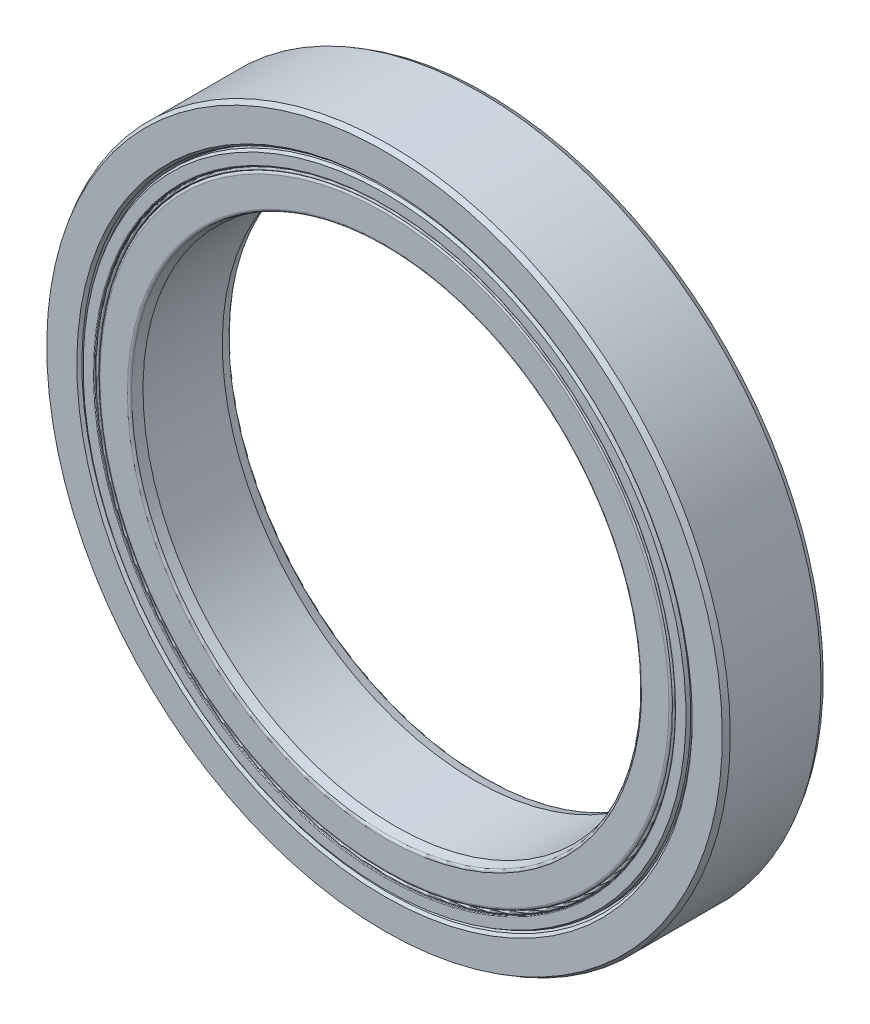
ISO-10303-21;
HEADER;
FILE_DESCRIPTION(('STEP AP214'),'2;1');
FILE_NAME('part.step','',(''),(''),'','','');
FILE_SCHEMA(('AUTOMOTIVE_DESIGN { 1 0 10303 214 1 1 1 1 }'));
ENDSEC;
DATA;
#1=APPLICATION_CONTEXT('core data for automotive mechanical design processes');
#2=APPLICATION_PROTOCOL_DEFINITION('international standard','automotive_design',2000,#1);
#3=PRODUCT_CONTEXT('',#1,'mechanical');
#4=PRODUCT('Part','Part','',(#3));
#5=PRODUCT_RELATED_PRODUCT_CATEGORY('part','',(#4));
#6=PRODUCT_DEFINITION_FORMATION('','',#4);
#7=PRODUCT_DEFINITION_CONTEXT('part definition',#1,'design');
#8=PRODUCT_DEFINITION('design','',#6,#7);
#9=PRODUCT_DEFINITION_SHAPE('','',#8);
#10=(LENGTH_UNIT() NAMED_UNIT(*) SI_UNIT(.MILLI.,.METRE.));
#11=(NAMED_UNIT(*) PLANE_ANGLE_UNIT() SI_UNIT($,.RADIAN.));
#12=(NAMED_UNIT(*) SI_UNIT($,.STERADIAN.) SOLID_ANGLE_UNIT());
#13=UNCERTAINTY_MEASURE_WITH_UNIT(LENGTH_MEASURE(1.E-05),#10,'distance_accuracy_value','');
#14=(GEOMETRIC_REPRESENTATION_CONTEXT(3) GLOBAL_UNCERTAINTY_ASSIGNED_CONTEXT((#13)) GLOBAL_UNIT_ASSIGNED_CONTEXT((#10,
#11,#12)) REPRESENTATION_CONTEXT('',''));
#15=CARTESIAN_POINT('',(0.,0.,0.));
#16=DIRECTION('',(0.,0.,1.));
#17=DIRECTION('',(1.,0.,0.));
#18=AXIS2_PLACEMENT_3D('',#15,#16,#17);
#19=CARTESIAN_POINT('',(0.,11.37,1.3125));
#20=DIRECTION('',(0.,0.,1.));
#21=DIRECTION('',(0.,-1.,0.));
#22=AXIS2_PLACEMENT_3D('',#19,#20,#21);
#23=PLANE('',#22);
#24=CARTESIAN_POINT('',(0.,0.,1.3125));
#25=DIRECTION('',(0.,0.,1.));
#26=DIRECTION('',(0.,-1.,0.));
#27=AXIS2_PLACEMENT_3D('',#24,#25,#26);
#28=CIRCLE('',#27,11.51);
#29=CARTESIAN_POINT('',(0.,-11.51,1.31249999999999));
#30=VERTEX_POINT('',#29);
#31=EDGE_CURVE('E11',#30,#30,#28,.T.);
#32=ORIENTED_EDGE('',*,*,#31,.F.);
#33=EDGE_LOOP('',(#32));
#34=FACE_BOUND('',#33,.T.);
#35=CARTESIAN_POINT('',(0.,0.,1.3125));
#36=DIRECTION('',(0.,0.,1.));
#37=DIRECTION('',(0.,-1.,0.));
#38=AXIS2_PLACEMENT_3D('',#35,#36,#37);
#39=CIRCLE('',#38,11.37);
#40=CARTESIAN_POINT('',(0.,-11.37,1.31249999999999));
#41=VERTEX_POINT('',#40);
#42=EDGE_CURVE('E70',#41,#41,#39,.T.);
#43=ORIENTED_EDGE('',*,*,#42,.T.);
#44=EDGE_LOOP('',(#43));
#45=FACE_BOUND('',#44,.T.);
#46=ADVANCED_FACE('F45',(#34,#45),#23,.F.);
#47=CARTESIAN_POINT('',(0.,0.,2.));
#48=DIRECTION('',(0.,0.,1.));
#49=DIRECTION('',(0.,-1.,0.));
#50=AXIS2_PLACEMENT_3D('',#47,#48,#49);
#51=CYLINDRICAL_SURFACE('',#50,11.51);
#52=CARTESIAN_POINT('',(0.,0.,1.89056210322341));
#53=DIRECTION('',(0.,0.,1.));
#54=DIRECTION('',(0.,-1.,0.));
#55=AXIS2_PLACEMENT_3D('',#52,#53,#54);
#56=CIRCLE('',#55,11.51);
#57=CARTESIAN_POINT('',(0.,-11.51,1.89056210322341));
#58=VERTEX_POINT('',#57);
#59=EDGE_CURVE('E51',#58,#58,#56,.T.);
#60=ORIENTED_EDGE('',*,*,#59,.F.);
#61=EDGE_LOOP('',(#60));
#62=FACE_BOUND('',#61,.T.);
#63=ORIENTED_EDGE('',*,*,#31,.T.);
#64=EDGE_LOOP('',(#63));
#65=FACE_BOUND('',#64,.T.);
#66=ADVANCED_FACE('F101',(#62,#65),#51,.T.);
#67=CARTESIAN_POINT('',(0.,0.,1.89056210322341));
#68=DIRECTION('',(0.,0.,-1.));
#69=DIRECTION('',(0.,1.,0.));
#70=AXIS2_PLACEMENT_3D('',#67,#68,#69);
#71=CONICAL_SURFACE('',#70,11.51,0.174532925199437);
#72=CARTESIAN_POINT('',(0.,0.,1.92503037457884));
#73=DIRECTION('',(0.,0.,1.));
#74=DIRECTION('',(0.,-1.,0.));
#75=AXIS2_PLACEMENT_3D('',#72,#73,#74);
#76=CIRCLE('',#75,11.5039223137817);
#77=CARTESIAN_POINT('',(0.,-11.5039223137817,1.92503037457883));
#78=VERTEX_POINT('',#77);
#79=EDGE_CURVE('E55',#78,#78,#76,.T.);
#80=ORIENTED_EDGE('',*,*,#79,.F.);
#81=EDGE_LOOP('',(#80));
#82=FACE_BOUND('',#81,.T.);
#83=ORIENTED_EDGE('',*,*,#59,.T.);
#84=EDGE_LOOP('',(#83));
#85=FACE_BOUND('',#84,.T.);
#86=ADVANCED_FACE('F96',(#82,#85),#71,.T.);
#87=CARTESIAN_POINT('',(0.,0.,1.9225));
#88=DIRECTION('',(0.,0.,1.));
#89=DIRECTION('',(0.,-1.,0.));
#90=AXIS2_PLACEMENT_3D('',#87,#88,#89);
#91=TOROIDAL_SURFACE('',#90,11.4895718464359,0.0145718464358908);
#92=CARTESIAN_POINT('',(0.,0.,1.9225));
#93=DIRECTION('',(0.,0.,1.));
#94=DIRECTION('',(0.,-1.,0.));
#95=AXIS2_PLACEMENT_3D('',#92,#93,#94);
#96=CIRCLE('',#95,11.475);
#97=CARTESIAN_POINT('',(0.,-11.475,1.9225));
#98=VERTEX_POINT('',#97);
#99=EDGE_CURVE('E59',#98,#98,#96,.T.);
#100=ORIENTED_EDGE('',*,*,#99,.F.);
#101=EDGE_LOOP('',(#100));
#102=FACE_BOUND('',#101,.T.);
#103=ORIENTED_EDGE('',*,*,#79,.T.);
#104=EDGE_LOOP('',(#103));
#105=FACE_BOUND('',#104,.T.);
#106=ADVANCED_FACE('F90',(#102,#105),#91,.T.);
#107=CARTESIAN_POINT('',(0.,0.,2.));
#108=DIRECTION('',(0.,0.,1.));
#109=DIRECTION('',(0.,-1.,0.));
#110=AXIS2_PLACEMENT_3D('',#107,#108,#109);
#111=CYLINDRICAL_SURFACE('',#110,11.475);
#112=CARTESIAN_POINT('',(0.,0.,1.9475));
#113=DIRECTION('',(0.,0.,1.));
#114=DIRECTION('',(0.,-1.,0.));
#115=AXIS2_PLACEMENT_3D('',#112,#113,#114);
#116=CIRCLE('',#115,11.475);
#117=CARTESIAN_POINT('',(0.,-11.475,1.9475));
#118=VERTEX_POINT('',#117);
#119=EDGE_CURVE('E64',#118,#118,#116,.T.);
#120=ORIENTED_EDGE('',*,*,#119,.F.);
#121=EDGE_LOOP('',(#120));
#122=FACE_BOUND('',#121,.T.);
#123=ORIENTED_EDGE('',*,*,#99,.T.);
#124=EDGE_LOOP('',(#123));
#125=FACE_BOUND('',#124,.T.);
#126=ADVANCED_FACE('F84',(#122,#125),#111,.T.);
#127=CARTESIAN_POINT('',(0.,0.,1.9475));
#128=DIRECTION('',(0.,0.,1.));
#129=DIRECTION('',(0.,-1.,0.));
#130=AXIS2_PLACEMENT_3D('',#127,#128,#129);
#131=TOROIDAL_SURFACE('',#130,11.4225,0.0525000000000005);
#132=CARTESIAN_POINT('',(0.,0.,1.9475));
#133=DIRECTION('',(0.,0.,1.));
#134=DIRECTION('',(0.,-1.,0.));
#135=AXIS2_PLACEMENT_3D('',#132,#133,#134);
#136=CIRCLE('',#135,11.37);
#137=CARTESIAN_POINT('',(0.,-11.37,1.9475));
#138=VERTEX_POINT('',#137);
#139=EDGE_CURVE('E67',#138,#138,#136,.T.);
#140=ORIENTED_EDGE('',*,*,#139,.F.);
#141=EDGE_LOOP('',(#140));
#142=FACE_BOUND('',#141,.T.);
#143=ORIENTED_EDGE('',*,*,#119,.T.);
#144=EDGE_LOOP('',(#143));
#145=FACE_BOUND('',#144,.T.);
#146=ADVANCED_FACE('F78',(#142,#145),#131,.T.);
#147=CARTESIAN_POINT('',(0.,0.,2.));
#148=DIRECTION('',(0.,0.,1.));
#149=DIRECTION('',(0.,-1.,0.));
#150=AXIS2_PLACEMENT_3D('',#147,#148,#149);
#151=CYLINDRICAL_SURFACE('',#150,11.37);
#152=ORIENTED_EDGE('',*,*,#42,.F.);
#153=EDGE_LOOP('',(#152));
#154=FACE_BOUND('',#153,.T.);
#155=ORIENTED_EDGE('',*,*,#139,.T.);
#156=EDGE_LOOP('',(#155));
#157=FACE_BOUND('',#156,.T.);
#158=ADVANCED_FACE('F75',(#154,#157),#151,.F.);
#159=CLOSED_SHELL('',(#46,#66,#86,#106,#126,#146,#158));
#160=MANIFOLD_SOLID_BREP('B2',#159);
#161=CARTESIAN_POINT('',(0.,0.,-2.00000000000001));
#162=DIRECTION('',(0.,0.,1.));
#163=DIRECTION('',(0.,-1.,0.));
#164=AXIS2_PLACEMENT_3D('',#161,#162,#163);
#165=CONICAL_SURFACE('',#164,11.945,0.5235987755983);
#166=CARTESIAN_POINT('',(0.,0.,-1.87875644347019));
#167=DIRECTION('',(0.,0.,1.));
#168=DIRECTION('',(0.,-1.,0.));
#169=AXIS2_PLACEMENT_3D('',#166,#167,#168);
#170=CIRCLE('',#169,12.015);
#171=CARTESIAN_POINT('',(0.,-12.015,-1.87875644347019));
#172=VERTEX_POINT('',#171);
#173=EDGE_CURVE('E167',#172,#172,#170,.T.);
#174=ORIENTED_EDGE('',*,*,#173,.F.);
#175=EDGE_LOOP('',(#174));
#176=FACE_BOUND('',#175,.T.);
#177=CARTESIAN_POINT('',(0.,0.,-2.00000000000001));
#178=DIRECTION('',(0.,0.,1.));
#179=DIRECTION('',(0.,-1.,0.));
#180=AXIS2_PLACEMENT_3D('',#177,#178,#179);
#181=CIRCLE('',#180,11.945);
#182=CARTESIAN_POINT('',(0.,-11.945,-2.00000000000001));
#183=VERTEX_POINT('',#182);
#184=EDGE_CURVE('E44',#183,#183,#181,.T.);
#185=ORIENTED_EDGE('',*,*,#184,.T.);
#186=EDGE_LOOP('',(#185));
#187=FACE_BOUND('',#186,.T.);
#188=ADVANCED_FACE('F145',(#176,#187),#165,.T.);
#189=CARTESIAN_POINT('',(0.,11.945,-2.00000000000001));
#190=DIRECTION('',(0.,0.,1.));
#191=DIRECTION('',(0.,-1.,0.));
#192=AXIS2_PLACEMENT_3D('',#189,#190,#191);
#193=PLANE('',#192);
#194=ORIENTED_EDGE('',*,*,#184,.F.);
#195=EDGE_LOOP('',(#194));
#196=FACE_BOUND('',#195,.T.);
#197=CARTESIAN_POINT('',(0.,0.,-2.00000000000001));
#198=DIRECTION('',(0.,0.,1.));
#199=DIRECTION('',(0.,-1.,0.));
#200=AXIS2_PLACEMENT_3D('',#197,#198,#199);
#201=CIRCLE('',#200,11.538);
#202=CARTESIAN_POINT('',(0.,-11.538,-2.00000000000001));
#203=VERTEX_POINT('',#202);
#204=EDGE_CURVE('E151',#203,#203,#201,.T.);
#205=ORIENTED_EDGE('',*,*,#204,.T.);
#206=EDGE_LOOP('',(#205));
#207=FACE_BOUND('',#206,.T.);
#208=ADVANCED_FACE('F174',(#196,#207),#193,.F.);
#209=CARTESIAN_POINT('',(0.,0.,-1.97200000000001));
#210=DIRECTION('',(0.,0.,1.));
#211=DIRECTION('',(0.,-1.,0.));
#212=AXIS2_PLACEMENT_3D('',#209,#210,#211);
#213=TOROIDAL_SURFACE('',#212,11.538,0.028);
#214=ORIENTED_EDGE('',*,*,#204,.F.);
#215=EDGE_LOOP('',(#214));
#216=FACE_BOUND('',#215,.T.);
#217=CARTESIAN_POINT('',(0.,0.,-1.97200000000001));
#218=DIRECTION('',(0.,0.,1.));
#219=DIRECTION('',(0.,-1.,0.));
#220=AXIS2_PLACEMENT_3D('',#217,#218,#219);
#221=CIRCLE('',#220,11.51);
#222=CARTESIAN_POINT('',(0.,-11.51,-1.97200000000001));
#223=VERTEX_POINT('',#222);
#224=EDGE_CURVE('E155',#223,#223,#221,.T.);
#225=ORIENTED_EDGE('',*,*,#224,.T.);
#226=EDGE_LOOP('',(#225));
#227=FACE_BOUND('',#226,.T.);
#228=ADVANCED_FACE('F178',(#216,#227),#213,.T.);
#229=CARTESIAN_POINT('',(0.,0.,2.));
#230=DIRECTION('',(0.,0.,1.));
#231=DIRECTION('',(0.,-1.,0.));
#232=AXIS2_PLACEMENT_3D('',#229,#230,#231);
#233=CYLINDRICAL_SURFACE('',#232,11.51);
#234=ORIENTED_EDGE('',*,*,#224,.F.);
#235=EDGE_LOOP('',(#234));
#236=FACE_BOUND('',#235,.T.);
#237=CARTESIAN_POINT('',(0.,0.,-1.3125));
#238=DIRECTION('',(0.,0.,1.));
#239=DIRECTION('',(0.,-1.,0.));
#240=AXIS2_PLACEMENT_3D('',#237,#238,#239);
#241=CIRCLE('',#240,11.51);
#242=CARTESIAN_POINT('',(0.,-11.51,-1.31250000000001));
#243=VERTEX_POINT('',#242);
#244=EDGE_CURVE('E159',#243,#243,#241,.T.);
#245=ORIENTED_EDGE('',*,*,#244,.T.);
#246=EDGE_LOOP('',(#245));
#247=FACE_BOUND('',#246,.T.);
#248=ADVANCED_FACE('F183',(#236,#247),#233,.F.);
#249=CARTESIAN_POINT('',(0.,12.015,-1.3125));
#250=DIRECTION('',(0.,0.,-1.));
#251=DIRECTION('',(0.,1.,0.));
#252=AXIS2_PLACEMENT_3D('',#249,#250,#251);
#253=PLANE('',#252);
#254=ORIENTED_EDGE('',*,*,#244,.F.);
#255=EDGE_LOOP('',(#254));
#256=FACE_BOUND('',#255,.T.);
#257=CARTESIAN_POINT('',(0.,0.,-1.3125));
#258=DIRECTION('',(0.,0.,1.));
#259=DIRECTION('',(0.,-1.,0.));
#260=AXIS2_PLACEMENT_3D('',#257,#258,#259);
#261=CIRCLE('',#260,12.015);
#262=CARTESIAN_POINT('',(0.,-12.015,-1.31250000000001));
#263=VERTEX_POINT('',#262);
#264=EDGE_CURVE('E164',#263,#263,#261,.T.);
#265=ORIENTED_EDGE('',*,*,#264,.T.);
#266=EDGE_LOOP('',(#265));
#267=FACE_BOUND('',#266,.T.);
#268=ADVANCED_FACE('F189',(#256,#267),#253,.F.);
#269=CARTESIAN_POINT('',(0.,0.,2.));
#270=DIRECTION('',(0.,0.,1.));
#271=DIRECTION('',(0.,-1.,0.));
#272=AXIS2_PLACEMENT_3D('',#269,#270,#271);
#273=CYLINDRICAL_SURFACE('',#272,12.015);
#274=ORIENTED_EDGE('',*,*,#264,.F.);
#275=EDGE_LOOP('',(#274));
#276=FACE_BOUND('',#275,.T.);
#277=ORIENTED_EDGE('',*,*,#173,.T.);
#278=EDGE_LOOP('',(#277));
#279=FACE_BOUND('',#278,.T.);
#280=ADVANCED_FACE('F171',(#276,#279),#273,.T.);
#281=CLOSED_SHELL('',(#188,#208,#228,#248,#268,#280));
#282=MANIFOLD_SOLID_BREP('B6',#281);
#283=CARTESIAN_POINT('',(0.,12.015,1.3125));
#284=DIRECTION('',(0.,0.,1.));
#285=DIRECTION('',(0.,-1.,0.));
#286=AXIS2_PLACEMENT_3D('',#283,#284,#285);
#287=PLANE('',#286);
#288=CARTESIAN_POINT('',(0.,0.,1.3125));
#289=DIRECTION('',(0.,0.,1.));
#290=DIRECTION('',(0.,-1.,0.));
#291=AXIS2_PLACEMENT_3D('',#288,#289,#290);
#292=CIRCLE('',#291,12.015);
#293=CARTESIAN_POINT('',(0.,-12.015,1.31249999999999));
#294=VERTEX_POINT('',#293);
#295=EDGE_CURVE('E144',#294,#294,#292,.T.);
#296=ORIENTED_EDGE('',*,*,#295,.F.);
#297=EDGE_LOOP('',(#296));
#298=FACE_BOUND('',#297,.T.);
#299=CARTESIAN_POINT('',(0.,0.,1.3125));
#300=DIRECTION('',(0.,0.,1.));
#301=DIRECTION('',(0.,-1.,0.));
#302=AXIS2_PLACEMENT_3D('',#299,#300,#301);
#303=CIRCLE('',#302,11.51);
#304=CARTESIAN_POINT('',(0.,-11.51,1.31249999999999));
#305=VERTEX_POINT('',#304);
#306=EDGE_CURVE('E252',#305,#305,#303,.T.);
#307=ORIENTED_EDGE('',*,*,#306,.T.);
#308=EDGE_LOOP('',(#307));
#309=FACE_BOUND('',#308,.T.);
#310=ADVANCED_FACE('F230',(#298,#309),#287,.F.);
#311=CARTESIAN_POINT('',(0.,0.,2.));
#312=DIRECTION('',(0.,0.,1.));
#313=DIRECTION('',(0.,-1.,0.));
#314=AXIS2_PLACEMENT_3D('',#311,#312,#313);
#315=CYLINDRICAL_SURFACE('',#314,12.015);
#316=CARTESIAN_POINT('',(0.,0.,1.87875644347018));
#317=DIRECTION('',(0.,0.,1.));
#318=DIRECTION('',(0.,-1.,0.));
#319=AXIS2_PLACEMENT_3D('',#316,#317,#318);
#320=CIRCLE('',#319,12.015);
#321=CARTESIAN_POINT('',(0.,-12.015,1.87875644347018));
#322=VERTEX_POINT('',#321);
#323=EDGE_CURVE('E236',#322,#322,#320,.T.);
#324=ORIENTED_EDGE('',*,*,#323,.F.);
#325=EDGE_LOOP('',(#324));
#326=FACE_BOUND('',#325,.T.);
#327=ORIENTED_EDGE('',*,*,#295,.T.);
#328=EDGE_LOOP('',(#327));
#329=FACE_BOUND('',#328,.T.);
#330=ADVANCED_FACE('F277',(#326,#329),#315,.T.);
#331=CARTESIAN_POINT('',(0.,0.,1.87875644347018));
#332=DIRECTION('',(0.,0.,-1.));
#333=DIRECTION('',(0.,1.,0.));
#334=AXIS2_PLACEMENT_3D('',#331,#332,#333);
#335=CONICAL_SURFACE('',#334,12.015,0.5235987755983);
#336=CARTESIAN_POINT('',(0.,0.,2.));
#337=DIRECTION('',(0.,0.,1.));
#338=DIRECTION('',(0.,-1.,0.));
#339=AXIS2_PLACEMENT_3D('',#336,#337,#338);
#340=CIRCLE('',#339,11.945);
#341=CARTESIAN_POINT('',(0.,-11.945,2.));
#342=VERTEX_POINT('',#341);
#343=EDGE_CURVE('E240',#342,#342,#340,.T.);
#344=ORIENTED_EDGE('',*,*,#343,.F.);
#345=EDGE_LOOP('',(#344));
#346=FACE_BOUND('',#345,.T.);
#347=ORIENTED_EDGE('',*,*,#323,.T.);
#348=EDGE_LOOP('',(#347));
#349=FACE_BOUND('',#348,.T.);
#350=ADVANCED_FACE('F272',(#346,#349),#335,.T.);
#351=CARTESIAN_POINT('',(0.,11.945,2.));
#352=DIRECTION('',(0.,0.,-1.));
#353=DIRECTION('',(0.,1.,0.));
#354=AXIS2_PLACEMENT_3D('',#351,#352,#353);
#355=PLANE('',#354);
#356=CARTESIAN_POINT('',(0.,0.,2.));
#357=DIRECTION('',(0.,0.,1.));
#358=DIRECTION('',(0.,-1.,0.));
#359=AXIS2_PLACEMENT_3D('',#356,#357,#358);
#360=CIRCLE('',#359,11.538);
#361=CARTESIAN_POINT('',(0.,-11.538,2.));
#362=VERTEX_POINT('',#361);
#363=EDGE_CURVE('E244',#362,#362,#360,.T.);
#364=ORIENTED_EDGE('',*,*,#363,.F.);
#365=EDGE_LOOP('',(#364));
#366=FACE_BOUND('',#365,.T.);
#367=ORIENTED_EDGE('',*,*,#343,.T.);
#368=EDGE_LOOP('',(#367));
#369=FACE_BOUND('',#368,.T.);
#370=ADVANCED_FACE('F266',(#366,#369),#355,.F.);
#371=CARTESIAN_POINT('',(0.,0.,1.972));
#372=DIRECTION('',(0.,0.,1.));
#373=DIRECTION('',(0.,-1.,0.));
#374=AXIS2_PLACEMENT_3D('',#371,#372,#373);
#375=TOROIDAL_SURFACE('',#374,11.538,0.028);
#376=CARTESIAN_POINT('',(0.,0.,1.972));
#377=DIRECTION('',(0.,0.,1.));
#378=DIRECTION('',(0.,-1.,0.));
#379=AXIS2_PLACEMENT_3D('',#376,#377,#378);
#380=CIRCLE('',#379,11.51);
#381=CARTESIAN_POINT('',(0.,-11.51,1.972));
#382=VERTEX_POINT('',#381);
#383=EDGE_CURVE('E249',#382,#382,#380,.T.);
#384=ORIENTED_EDGE('',*,*,#383,.F.);
#385=EDGE_LOOP('',(#384));
#386=FACE_BOUND('',#385,.T.);
#387=ORIENTED_EDGE('',*,*,#363,.T.);
#388=EDGE_LOOP('',(#387));
#389=FACE_BOUND('',#388,.T.);
#390=ADVANCED_FACE('F260',(#386,#389),#375,.T.);
#391=CARTESIAN_POINT('',(0.,0.,2.));
#392=DIRECTION('',(0.,0.,1.));
#393=DIRECTION('',(0.,-1.,0.));
#394=AXIS2_PLACEMENT_3D('',#391,#392,#393);
#395=CYLINDRICAL_SURFACE('',#394,11.51);
#396=ORIENTED_EDGE('',*,*,#306,.F.);
#397=EDGE_LOOP('',(#396));
#398=FACE_BOUND('',#397,.T.);
#399=ORIENTED_EDGE('',*,*,#383,.T.);
#400=EDGE_LOOP('',(#399));
#401=FACE_BOUND('',#400,.T.);
#402=ADVANCED_FACE('F257',(#398,#401),#395,.F.);
#403=CLOSED_SHELL('',(#310,#330,#350,#370,#390,#402));
#404=MANIFOLD_SOLID_BREP('B39',#403);
#405=CARTESIAN_POINT('',(-3.99907052583524,10.9873559685393,0.));
#406=DIRECTION('',(0.,0.,1.));
#407=DIRECTION('',(-0.342020143325657,0.939692620785913,0.));
#408=AXIS2_PLACEMENT_3D('',#405,#406,#407);
#409=SPHERICAL_SURFACE('',#408,1.3125);
#410=CARTESIAN_POINT('',(-3.99907052583524,10.9873559685393,1.3125));
#411=VERTEX_POINT('',#410);
#412=VERTEX_LOOP('',#411);
#413=FACE_BOUND('',#412,.T.);
#414=ADVANCED_FACE('F334',(#413),#409,.T.);
#415=CLOSED_SHELL('',(#414));
#416=MANIFOLD_SOLID_BREP('B139',#415);
#417=CARTESIAN_POINT('',(-7.51579412625975,8.95697465116874,0.));
#418=DIRECTION('',(0.,0.,1.));
#419=DIRECTION('',(-0.64278760968653,0.766044443118986,0.));
#420=AXIS2_PLACEMENT_3D('',#417,#418,#419);
#421=SPHERICAL_SURFACE('',#420,1.3125);
#422=CARTESIAN_POINT('',(-7.51579412625975,8.95697465116874,1.3125));
#423=VERTEX_POINT('',#422);
#424=VERTEX_LOOP('',#423);
#425=FACE_BOUND('',#424,.T.);
#426=ADVANCED_FACE('F350',(#425),#421,.T.);
#427=CLOSED_SHELL('',(#426));
#428=MANIFOLD_SOLID_BREP('B226',#427);
#429=CARTESIAN_POINT('',(-10.1260020337495,5.84625000000012,0.));
#430=DIRECTION('',(0.,0.,1.));
#431=DIRECTION('',(-0.866025403784433,0.50000000000001,0.));
#432=AXIS2_PLACEMENT_3D('',#429,#430,#431);
#433=SPHERICAL_SURFACE('',#432,1.3125);
#434=CARTESIAN_POINT('',(-10.1260020337495,5.84625000000012,1.3125));
#435=VERTEX_POINT('',#434);
#436=VERTEX_LOOP('',#435);
#437=FACE_BOUND('',#436,.T.);
#438=ADVANCED_FACE('F366',(#437),#433,.T.);
#439=CLOSED_SHELL('',(#438));
#440=MANIFOLD_SOLID_BREP('B330',#439);
#441=CARTESIAN_POINT('',(-11.5148646520952,2.0303813173707,0.));
#442=DIRECTION('',(0.,0.,1.));
#443=DIRECTION('',(-0.984807753012206,0.17364817766694,0.));
#444=AXIS2_PLACEMENT_3D('',#441,#442,#443);
#445=SPHERICAL_SURFACE('',#444,1.3125);
#446=CARTESIAN_POINT('',(-11.5148646520952,2.0303813173707,1.3125));
#447=VERTEX_POINT('',#446);
#448=VERTEX_LOOP('',#447);
#449=FACE_BOUND('',#448,.T.);
#450=ADVANCED_FACE('F382',(#449),#445,.T.);
#451=CLOSED_SHELL('',(#450));
#452=MANIFOLD_SOLID_BREP('B346',#451);
#453=CARTESIAN_POINT('',(-11.5148646520953,-2.03038131737047,0.));
#454=DIRECTION('',(0.,0.,1.));
#455=DIRECTION('',(-0.98480775301221,-0.173648177666921,0.));
#456=AXIS2_PLACEMENT_3D('',#453,#454,#455);
#457=SPHERICAL_SURFACE('',#456,1.3125);
#458=CARTESIAN_POINT('',(-11.5148646520953,-2.03038131737047,1.3125));
#459=VERTEX_POINT('',#458);
#460=VERTEX_LOOP('',#459);
#461=FACE_BOUND('',#460,.T.);
#462=ADVANCED_FACE('F398',(#461),#457,.T.);
#463=CLOSED_SHELL('',(#462));
#464=MANIFOLD_SOLID_BREP('B362',#463);
#465=CARTESIAN_POINT('',(-10.1260020337496,-5.84624999999991,0.));
#466=DIRECTION('',(0.,0.,1.));
#467=DIRECTION('',(-0.866025403784443,-0.499999999999992,0.));
#468=AXIS2_PLACEMENT_3D('',#465,#466,#467);
#469=SPHERICAL_SURFACE('',#468,1.3125);
#470=CARTESIAN_POINT('',(-10.1260020337496,-5.84624999999991,1.3125));
#471=VERTEX_POINT('',#470);
#472=VERTEX_LOOP('',#471);
#473=FACE_BOUND('',#472,.T.);
#474=ADVANCED_FACE('F414',(#473),#469,.T.);
#475=CLOSED_SHELL('',(#474));
#476=MANIFOLD_SOLID_BREP('B378',#475);
#477=CARTESIAN_POINT('',(-7.51579412625994,-8.95697465116859,0.));
#478=DIRECTION('',(0.,0.,1.));
#479=DIRECTION('',(-0.642787609686546,-0.766044443118973,0.));
#480=AXIS2_PLACEMENT_3D('',#477,#478,#479);
#481=SPHERICAL_SURFACE('',#480,1.3125);
#482=CARTESIAN_POINT('',(-7.51579412625994,-8.95697465116859,1.3125));
#483=VERTEX_POINT('',#482);
#484=VERTEX_LOOP('',#483);
#485=FACE_BOUND('',#484,.T.);
#486=ADVANCED_FACE('F430',(#485),#481,.T.);
#487=CLOSED_SHELL('',(#486));
#488=MANIFOLD_SOLID_BREP('B394',#487);
#489=CARTESIAN_POINT('',(-3.99907052583546,-10.9873559685392,0.));
#490=DIRECTION('',(0.,0.,1.));
#491=DIRECTION('',(-0.342020143325676,-0.939692620785906,0.));
#492=AXIS2_PLACEMENT_3D('',#489,#490,#491);
#493=SPHERICAL_SURFACE('',#492,1.3125);
#494=CARTESIAN_POINT('',(-3.99907052583546,-10.9873559685392,1.3125));
#495=VERTEX_POINT('',#494);
#496=VERTEX_LOOP('',#495);
#497=FACE_BOUND('',#496,.T.);
#498=ADVANCED_FACE('F446',(#497),#493,.T.);
#499=CLOSED_SHELL('',(#498));
#500=MANIFOLD_SOLID_BREP('B410',#499);
#501=CARTESIAN_POINT('',(0.,-11.6925,0.));
#502=DIRECTION('',(0.,0.,1.));
#503=DIRECTION('',(0.,-1.,0.));
#504=AXIS2_PLACEMENT_3D('',#501,#502,#503);
#505=SPHERICAL_SURFACE('',#504,1.3125);
#506=CARTESIAN_POINT('',(0.,-11.6925,1.3125));
#507=VERTEX_POINT('',#506);
#508=VERTEX_LOOP('',#507);
#509=FACE_BOUND('',#508,.T.);
#510=ADVANCED_FACE('F462',(#509),#505,.T.);
#511=CLOSED_SHELL('',(#510));
#512=MANIFOLD_SOLID_BREP('B426',#511);
#513=CARTESIAN_POINT('',(3.99907052583532,-10.9873559685393,0.));
#514=DIRECTION('',(0.,0.,1.));
#515=DIRECTION('',(0.342020143325663,-0.939692620785911,0.));
#516=AXIS2_PLACEMENT_3D('',#513,#514,#515);
#517=SPHERICAL_SURFACE('',#516,1.3125);
#518=CARTESIAN_POINT('',(3.99907052583532,-10.9873559685393,1.3125));
#519=VERTEX_POINT('',#518);
#520=VERTEX_LOOP('',#519);
#521=FACE_BOUND('',#520,.T.);
#522=ADVANCED_FACE('F478',(#521),#517,.T.);
#523=CLOSED_SHELL('',(#522));
#524=MANIFOLD_SOLID_BREP('B442',#523);
#525=CARTESIAN_POINT('',(7.51579412625982,-8.95697465116869,0.));
#526=DIRECTION('',(0.,0.,1.));
#527=DIRECTION('',(0.642787609686535,-0.766044443118981,0.));
#528=AXIS2_PLACEMENT_3D('',#525,#526,#527);
#529=SPHERICAL_SURFACE('',#528,1.3125);
#530=CARTESIAN_POINT('',(7.51579412625982,-8.95697465116869,1.3125));
#531=VERTEX_POINT('',#530);
#532=VERTEX_LOOP('',#531);
#533=FACE_BOUND('',#532,.T.);
#534=ADVANCED_FACE('F494',(#533),#529,.T.);
#535=CLOSED_SHELL('',(#534));
#536=MANIFOLD_SOLID_BREP('B458',#535);
#537=CARTESIAN_POINT('',(10.1260020337495,-5.84625000000005,0.));
#538=DIRECTION('',(0.,0.,1.));
#539=DIRECTION('',(0.866025403784436,-0.500000000000004,0.));
#540=AXIS2_PLACEMENT_3D('',#537,#538,#539);
#541=SPHERICAL_SURFACE('',#540,1.3125);
#542=CARTESIAN_POINT('',(10.1260020337495,-5.84625000000005,1.3125));
#543=VERTEX_POINT('',#542);
#544=VERTEX_LOOP('',#543);
#545=FACE_BOUND('',#544,.T.);
#546=ADVANCED_FACE('F510',(#545),#541,.T.);
#547=CLOSED_SHELL('',(#546));
#548=MANIFOLD_SOLID_BREP('B474',#547);
#549=CARTESIAN_POINT('',(11.5148646520952,-2.03038131737063,0.));
#550=DIRECTION('',(0.,0.,1.));
#551=DIRECTION('',(0.984807753012207,-0.173648177666934,0.));
#552=AXIS2_PLACEMENT_3D('',#549,#550,#551);
#553=SPHERICAL_SURFACE('',#552,1.3125);
#554=CARTESIAN_POINT('',(11.5148646520952,-2.03038131737063,1.3125));
#555=VERTEX_POINT('',#554);
#556=VERTEX_LOOP('',#555);
#557=FACE_BOUND('',#556,.T.);
#558=ADVANCED_FACE('F526',(#557),#553,.T.);
#559=CLOSED_SHELL('',(#558));
#560=MANIFOLD_SOLID_BREP('B490',#559);
#561=CARTESIAN_POINT('',(11.5148646520953,2.03038131737055,0.));
#562=DIRECTION('',(0.,0.,1.));
#563=DIRECTION('',(0.984807753012209,0.173648177666927,0.));
#564=AXIS2_PLACEMENT_3D('',#561,#562,#563);
#565=SPHERICAL_SURFACE('',#564,1.3125);
#566=CARTESIAN_POINT('',(11.5148646520953,2.03038131737055,1.3125));
#567=VERTEX_POINT('',#566);
#568=VERTEX_LOOP('',#567);
#569=FACE_BOUND('',#568,.T.);
#570=ADVANCED_FACE('F542',(#569),#565,.T.);
#571=CLOSED_SHELL('',(#570));
#572=MANIFOLD_SOLID_BREP('B506',#571);
#573=CARTESIAN_POINT('',(10.1260020337496,5.84624999999998,0.));
#574=DIRECTION('',(0.,0.,1.));
#575=DIRECTION('',(0.86602540378444,0.499999999999998,0.));
#576=AXIS2_PLACEMENT_3D('',#573,#574,#575);
#577=SPHERICAL_SURFACE('',#576,1.3125);
#578=CARTESIAN_POINT('',(10.1260020337496,5.84624999999998,1.3125));
#579=VERTEX_POINT('',#578);
#580=VERTEX_LOOP('',#579);
#581=FACE_BOUND('',#580,.T.);
#582=ADVANCED_FACE('F558',(#581),#577,.T.);
#583=CLOSED_SHELL('',(#582));
#584=MANIFOLD_SOLID_BREP('B522',#583);
#585=CARTESIAN_POINT('',(7.51579412625988,8.95697465116864,0.));
#586=DIRECTION('',(0.,0.,1.));
#587=DIRECTION('',(0.642787609686541,0.766044443118977,0.));
#588=AXIS2_PLACEMENT_3D('',#585,#586,#587);
#589=SPHERICAL_SURFACE('',#588,1.3125);
#590=CARTESIAN_POINT('',(7.51579412625988,8.95697465116864,1.3125));
#591=VERTEX_POINT('',#590);
#592=VERTEX_LOOP('',#591);
#593=FACE_BOUND('',#592,.T.);
#594=ADVANCED_FACE('F574',(#593),#589,.T.);
#595=CLOSED_SHELL('',(#594));
#596=MANIFOLD_SOLID_BREP('B538',#595);
#597=CARTESIAN_POINT('',(3.99907052583539,10.9873559685392,0.));
#598=DIRECTION('',(0.,0.,1.));
#599=DIRECTION('',(0.342020143325669,0.939692620785908,0.));
#600=AXIS2_PLACEMENT_3D('',#597,#598,#599);
#601=SPHERICAL_SURFACE('',#600,1.3125);
#602=CARTESIAN_POINT('',(3.99907052583539,10.9873559685392,1.3125));
#603=VERTEX_POINT('',#602);
#604=VERTEX_LOOP('',#603);
#605=FACE_BOUND('',#604,.T.);
#606=ADVANCED_FACE('F590',(#605),#601,.T.);
#607=CLOSED_SHELL('',(#606));
#608=MANIFOLD_SOLID_BREP('B554',#607);
#609=CARTESIAN_POINT('',(0.,11.6925,0.));
#610=DIRECTION('',(0.,0.,1.));
#611=DIRECTION('',(0.,1.,0.));
#612=AXIS2_PLACEMENT_3D('',#609,#610,#611);
#613=SPHERICAL_SURFACE('',#612,1.3125);
#614=CARTESIAN_POINT('',(0.,11.6925,1.3125));
#615=VERTEX_POINT('',#614);
#616=VERTEX_LOOP('',#615);
#617=FACE_BOUND('',#616,.T.);
#618=ADVANCED_FACE('F608',(#617),#613,.T.);
#619=CLOSED_SHELL('',(#618));
#620=MANIFOLD_SOLID_BREP('B570',#619);
#621=CARTESIAN_POINT('',(0.,0.,-1.90164876286105));
#622=DIRECTION('',(0.,0.,1.));
#623=DIRECTION('',(0.,-1.,0.));
#624=AXIS2_PLACEMENT_3D('',#621,#622,#623);
#625=TOROIDAL_SURFACE('',#624,10.19,0.0983512371389572);
#626=CARTESIAN_POINT('',(0.,0.,-2.00000000000001));
#627=DIRECTION('',(0.,0.,1.));
#628=DIRECTION('',(0.,-1.,0.));
#629=AXIS2_PLACEMENT_3D('',#626,#627,#628);
#630=CIRCLE('',#629,10.19);
#631=CARTESIAN_POINT('',(0.,-10.19,-2.00000000000001));
#632=VERTEX_POINT('',#631);
#633=EDGE_CURVE('E607',#632,#632,#630,.T.);
#634=ORIENTED_EDGE('',*,*,#633,.F.);
#635=EDGE_LOOP('',(#634));
#636=FACE_BOUND('',#635,.T.);
#637=CARTESIAN_POINT('',(0.,0.,-1.92710393614201));
#638=DIRECTION('',(0.,0.,1.));
#639=DIRECTION('',(0.,-1.,0.));
#640=AXIS2_PLACEMENT_3D('',#637,#638,#639);
#641=CIRCLE('',#640,10.095);
#642=CARTESIAN_POINT('',(0.,-10.095,-1.92710393614201));
#643=VERTEX_POINT('',#642);
#644=EDGE_CURVE('E665',#643,#643,#641,.T.);
#645=ORIENTED_EDGE('',*,*,#644,.T.);
#646=EDGE_LOOP('',(#645));
#647=FACE_BOUND('',#646,.T.);
#648=ADVANCED_FACE('F625',(#636,#647),#625,.T.);
#649=CARTESIAN_POINT('',(0.,10.19,-2.));
#650=DIRECTION('',(0.,0.,1.));
#651=DIRECTION('',(0.,-1.,0.));
#652=AXIS2_PLACEMENT_3D('',#649,#650,#651);
#653=PLANE('',#652);
#654=CARTESIAN_POINT('',(0.,0.,-2.00000000000001));
#655=DIRECTION('',(0.,0.,1.));
#656=DIRECTION('',(0.,-1.,0.));
#657=AXIS2_PLACEMENT_3D('',#654,#655,#656);
#658=CIRCLE('',#657,11.2716487628611);
#659=CARTESIAN_POINT('',(0.,-11.2716487628611,-2.00000000000001));
#660=VERTEX_POINT('',#659);
#661=EDGE_CURVE('E631',#660,#660,#658,.T.);
#662=ORIENTED_EDGE('',*,*,#661,.F.);
#663=EDGE_LOOP('',(#662));
#664=FACE_BOUND('',#663,.T.);
#665=ORIENTED_EDGE('',*,*,#633,.T.);
#666=EDGE_LOOP('',(#665));
#667=FACE_BOUND('',#666,.T.);
#668=ADVANCED_FACE('F726',(#664,#667),#653,.F.);
#669=CARTESIAN_POINT('',(0.,0.,-1.90164876286105));
#670=DIRECTION('',(0.,0.,1.));
#671=DIRECTION('',(0.,-1.,0.));
#672=AXIS2_PLACEMENT_3D('',#669,#670,#671);
#673=TOROIDAL_SURFACE('',#672,11.2716487628611,0.0983512371389565);
#674=CARTESIAN_POINT('',(0.,0.,-1.90164876286105));
#675=DIRECTION('',(0.,0.,1.));
#676=DIRECTION('',(0.,-1.,0.));
#677=AXIS2_PLACEMENT_3D('',#674,#675,#676);
#678=CIRCLE('',#677,11.37);
#679=CARTESIAN_POINT('',(0.,-11.37,-1.90164876286105));
#680=VERTEX_POINT('',#679);
#681=EDGE_CURVE('E635',#680,#680,#678,.T.);
#682=ORIENTED_EDGE('',*,*,#681,.F.);
#683=EDGE_LOOP('',(#682));
#684=FACE_BOUND('',#683,.T.);
#685=ORIENTED_EDGE('',*,*,#661,.T.);
#686=EDGE_LOOP('',(#685));
#687=FACE_BOUND('',#686,.T.);
#688=ADVANCED_FACE('F721',(#684,#687),#673,.T.);
#689=CARTESIAN_POINT('',(0.,0.,2.));
#690=DIRECTION('',(0.,0.,1.));
#691=DIRECTION('',(0.,-1.,0.));
#692=AXIS2_PLACEMENT_3D('',#689,#690,#691);
#693=CYLINDRICAL_SURFACE('',#692,11.37);
#694=CARTESIAN_POINT('',(0.,0.,-1.27226176551841));
#695=DIRECTION('',(0.,0.,1.));
#696=DIRECTION('',(0.,-1.,0.));
#697=AXIS2_PLACEMENT_3D('',#694,#695,#696);
#698=CIRCLE('',#697,11.37);
#699=CARTESIAN_POINT('',(0.,-11.37,-1.27226176551841));
#700=VERTEX_POINT('',#699);
#701=EDGE_CURVE('E639',#700,#700,#698,.T.);
#702=ORIENTED_EDGE('',*,*,#701,.F.);
#703=EDGE_LOOP('',(#702));
#704=FACE_BOUND('',#703,.T.);
#705=ORIENTED_EDGE('',*,*,#681,.T.);
#706=EDGE_LOOP('',(#705));
#707=FACE_BOUND('',#706,.T.);
#708=ADVANCED_FACE('F715',(#704,#707),#693,.T.);
#709=CARTESIAN_POINT('',(0.,0.,0.));
#710=DIRECTION('',(0.,0.,1.));
#711=DIRECTION('',(0.,-1.,0.));
#712=AXIS2_PLACEMENT_3D('',#709,#710,#711);
#713=TOROIDAL_SURFACE('',#712,11.6925,1.3125);
#714=CARTESIAN_POINT('',(0.,0.,1.2722617655184));
#715=DIRECTION('',(0.,0.,1.));
#716=DIRECTION('',(0.,-1.,0.));
#717=AXIS2_PLACEMENT_3D('',#714,#715,#716);
#718=CIRCLE('',#717,11.37);
#719=CARTESIAN_POINT('',(0.,-11.37,1.2722617655184));
#720=VERTEX_POINT('',#719);
#721=EDGE_CURVE('E644',#720,#720,#718,.T.);
#722=ORIENTED_EDGE('',*,*,#721,.F.);
#723=EDGE_LOOP('',(#722));
#724=FACE_BOUND('',#723,.T.);
#725=ORIENTED_EDGE('',*,*,#701,.T.);
#726=EDGE_LOOP('',(#725));
#727=FACE_BOUND('',#726,.T.);
#728=ADVANCED_FACE('F709',(#724,#727),#713,.F.);
#729=CARTESIAN_POINT('',(0.,0.,2.));
#730=DIRECTION('',(0.,0.,1.));
#731=DIRECTION('',(0.,-1.,0.));
#732=AXIS2_PLACEMENT_3D('',#729,#730,#731);
#733=CYLINDRICAL_SURFACE('',#732,11.37);
#734=CARTESIAN_POINT('',(0.,0.,1.90164876286105));
#735=DIRECTION('',(0.,0.,1.));
#736=DIRECTION('',(0.,-1.,0.));
#737=AXIS2_PLACEMENT_3D('',#734,#735,#736);
#738=CIRCLE('',#737,11.37);
#739=CARTESIAN_POINT('',(0.,-11.37,1.90164876286104));
#740=VERTEX_POINT('',#739);
#741=EDGE_CURVE('E647',#740,#740,#738,.T.);
#742=ORIENTED_EDGE('',*,*,#741,.F.);
#743=EDGE_LOOP('',(#742));
#744=FACE_BOUND('',#743,.T.);
#745=ORIENTED_EDGE('',*,*,#721,.T.);
#746=EDGE_LOOP('',(#745));
#747=FACE_BOUND('',#746,.T.);
#748=ADVANCED_FACE('F703',(#744,#747),#733,.T.);
#749=CARTESIAN_POINT('',(0.,0.,1.90164876286105));
#750=DIRECTION('',(0.,0.,1.));
#751=DIRECTION('',(0.,-1.,0.));
#752=AXIS2_PLACEMENT_3D('',#749,#750,#751);
#753=TOROIDAL_SURFACE('',#752,11.2716487628611,0.0983512371389565);
#754=CARTESIAN_POINT('',(0.,0.,2.));
#755=DIRECTION('',(0.,0.,1.));
#756=DIRECTION('',(0.,-1.,0.));
#757=AXIS2_PLACEMENT_3D('',#754,#755,#756);
#758=CIRCLE('',#757,11.2716487628611);
#759=CARTESIAN_POINT('',(0.,-11.2716487628611,2.));
#760=VERTEX_POINT('',#759);
#761=EDGE_CURVE('E650',#760,#760,#758,.T.);
#762=ORIENTED_EDGE('',*,*,#761,.F.);
#763=EDGE_LOOP('',(#762));
#764=FACE_BOUND('',#763,.T.);
#765=ORIENTED_EDGE('',*,*,#741,.T.);
#766=EDGE_LOOP('',(#765));
#767=FACE_BOUND('',#766,.T.);
#768=ADVANCED_FACE('F697',(#764,#767),#753,.T.);
#769=CARTESIAN_POINT('',(0.,10.19,2.));
#770=DIRECTION('',(0.,0.,-1.));
#771=DIRECTION('',(0.,1.,0.));
#772=AXIS2_PLACEMENT_3D('',#769,#770,#771);
#773=PLANE('',#772);
#774=CARTESIAN_POINT('',(0.,0.,2.));
#775=DIRECTION('',(0.,0.,1.));
#776=DIRECTION('',(0.,-1.,0.));
#777=AXIS2_PLACEMENT_3D('',#774,#775,#776);
#778=CIRCLE('',#777,10.19);
#779=CARTESIAN_POINT('',(0.,-10.19,2.));
#780=VERTEX_POINT('',#779);
#781=EDGE_CURVE('E653',#780,#780,#778,.T.);
#782=ORIENTED_EDGE('',*,*,#781,.F.);
#783=EDGE_LOOP('',(#782));
#784=FACE_BOUND('',#783,.T.);
#785=ORIENTED_EDGE('',*,*,#761,.T.);
#786=EDGE_LOOP('',(#785));
#787=FACE_BOUND('',#786,.T.);
#788=ADVANCED_FACE('F691',(#784,#787),#773,.F.);
#789=CARTESIAN_POINT('',(0.,0.,1.90164876286105));
#790=DIRECTION('',(0.,0.,1.));
#791=DIRECTION('',(0.,-1.,0.));
#792=AXIS2_PLACEMENT_3D('',#789,#790,#791);
#793=TOROIDAL_SURFACE('',#792,10.19,0.098351237138958);
#794=CARTESIAN_POINT('',(0.,0.,1.927103936142));
#795=DIRECTION('',(0.,0.,1.));
#796=DIRECTION('',(0.,-1.,0.));
#797=AXIS2_PLACEMENT_3D('',#794,#795,#796);
#798=CIRCLE('',#797,10.095);
#799=CARTESIAN_POINT('',(0.,-10.095,1.927103936142));
#800=VERTEX_POINT('',#799);
#801=EDGE_CURVE('E656',#800,#800,#798,.T.);
#802=ORIENTED_EDGE('',*,*,#801,.F.);
#803=EDGE_LOOP('',(#802));
#804=FACE_BOUND('',#803,.T.);
#805=ORIENTED_EDGE('',*,*,#781,.T.);
#806=EDGE_LOOP('',(#805));
#807=FACE_BOUND('',#806,.T.);
#808=ADVANCED_FACE('F685',(#804,#807),#793,.T.);
#809=CARTESIAN_POINT('',(0.,0.,1.927103936142));
#810=DIRECTION('',(0.,0.,1.));
#811=DIRECTION('',(0.,-1.,0.));
#812=AXIS2_PLACEMENT_3D('',#809,#810,#811);
#813=CONICAL_SURFACE('',#812,10.095,0.261799387799152);
#814=CARTESIAN_POINT('',(0.,0.,1.57255910942296));
#815=DIRECTION('',(0.,0.,1.));
#816=DIRECTION('',(0.,-1.,0.));
#817=AXIS2_PLACEMENT_3D('',#814,#815,#816);
#818=CIRCLE('',#817,10.);
#819=CARTESIAN_POINT('',(0.,-10.,1.57255910942296));
#820=VERTEX_POINT('',#819);
#821=EDGE_CURVE('E659',#820,#820,#818,.T.);
#822=ORIENTED_EDGE('',*,*,#821,.F.);
#823=EDGE_LOOP('',(#822));
#824=FACE_BOUND('',#823,.T.);
#825=ORIENTED_EDGE('',*,*,#801,.T.);
#826=EDGE_LOOP('',(#825));
#827=FACE_BOUND('',#826,.T.);
#828=ADVANCED_FACE('F679',(#824,#827),#813,.F.);
#829=CARTESIAN_POINT('',(0.,0.,2.));
#830=DIRECTION('',(0.,0.,1.));
#831=DIRECTION('',(0.,-1.,0.));
#832=AXIS2_PLACEMENT_3D('',#829,#830,#831);
#833=CYLINDRICAL_SURFACE('',#832,10.);
#834=CARTESIAN_POINT('',(0.,0.,-1.57255910942297));
#835=DIRECTION('',(0.,0.,1.));
#836=DIRECTION('',(0.,-1.,0.));
#837=AXIS2_PLACEMENT_3D('',#834,#835,#836);
#838=CIRCLE('',#837,10.);
#839=CARTESIAN_POINT('',(0.,-10.,-1.57255910942297));
#840=VERTEX_POINT('',#839);
#841=EDGE_CURVE('E662',#840,#840,#838,.T.);
#842=ORIENTED_EDGE('',*,*,#841,.F.);
#843=EDGE_LOOP('',(#842));
#844=FACE_BOUND('',#843,.T.);
#845=ORIENTED_EDGE('',*,*,#821,.T.);
#846=EDGE_LOOP('',(#845));
#847=FACE_BOUND('',#846,.T.);
#848=ADVANCED_FACE('F673',(#844,#847),#833,.F.);
#849=CARTESIAN_POINT('',(0.,0.,-1.57255910942297));
#850=DIRECTION('',(0.,0.,-1.));
#851=DIRECTION('',(0.,1.,0.));
#852=AXIS2_PLACEMENT_3D('',#849,#850,#851);
#853=CONICAL_SURFACE('',#852,10.,0.261799387799153);
#854=ORIENTED_EDGE('',*,*,#644,.F.);
#855=EDGE_LOOP('',(#854));
#856=FACE_BOUND('',#855,.T.);
#857=ORIENTED_EDGE('',*,*,#841,.T.);
#858=EDGE_LOOP('',(#857));
#859=FACE_BOUND('',#858,.T.);
#860=ADVANCED_FACE('F670',(#856,#859),#853,.F.);
#861=CLOSED_SHELL('',(#648,#668,#688,#708,#728,#748,#768,#788,#808,#828,#848,#860));
#862=MANIFOLD_SOLID_BREP('B586',#861);
#863=CARTESIAN_POINT('',(0.,0.,2.));
#864=DIRECTION('',(0.,0.,1.));
#865=DIRECTION('',(0.,-1.,0.));
#866=AXIS2_PLACEMENT_3D('',#863,#864,#865);
#867=CYLINDRICAL_SURFACE('',#866,12.015);
#868=CARTESIAN_POINT('',(0.,0.,1.2722617655184));
#869=DIRECTION('',(0.,0.,1.));
#870=DIRECTION('',(0.,-1.,0.));
#871=AXIS2_PLACEMENT_3D('',#868,#869,#870);
#872=CIRCLE('',#871,12.015);
#873=CARTESIAN_POINT('',(0.,-12.015,1.2722617655184));
#874=VERTEX_POINT('',#873);
#875=EDGE_CURVE('E624',#874,#874,#872,.T.);
#876=ORIENTED_EDGE('',*,*,#875,.F.);
#877=EDGE_LOOP('',(#876));
#878=FACE_BOUND('',#877,.T.);
#879=CARTESIAN_POINT('',(0.,0.,1.6829872849735));
#880=DIRECTION('',(0.,0.,1.));
#881=DIRECTION('',(0.,-1.,0.));
#882=AXIS2_PLACEMENT_3D('',#879,#880,#881);
#883=CIRCLE('',#882,12.015);
#884=CARTESIAN_POINT('',(0.,-12.015,1.6829872849735));
#885=VERTEX_POINT('',#884);
#886=EDGE_CURVE('E822',#885,#885,#883,.T.);
#887=ORIENTED_EDGE('',*,*,#886,.T.);
#888=EDGE_LOOP('',(#887));
#889=FACE_BOUND('',#888,.T.);
#890=ADVANCED_FACE('F782',(#878,#889),#867,.F.);
#891=CARTESIAN_POINT('',(0.,0.,0.));
#892=DIRECTION('',(0.,0.,1.));
#893=DIRECTION('',(0.,-1.,0.));
#894=AXIS2_PLACEMENT_3D('',#891,#892,#893);
#895=TOROIDAL_SURFACE('',#894,11.6925,1.3125);
#896=CARTESIAN_POINT('',(0.,0.,-1.27226176551841));
#897=DIRECTION('',(0.,0.,1.));
#898=DIRECTION('',(0.,-1.,0.));
#899=AXIS2_PLACEMENT_3D('',#896,#897,#898);
#900=CIRCLE('',#899,12.015);
#901=CARTESIAN_POINT('',(0.,-12.015,-1.27226176551841));
#902=VERTEX_POINT('',#901);
#903=EDGE_CURVE('E788',#902,#902,#900,.T.);
#904=ORIENTED_EDGE('',*,*,#903,.F.);
#905=EDGE_LOOP('',(#904));
#906=FACE_BOUND('',#905,.T.);
#907=ORIENTED_EDGE('',*,*,#875,.T.);
#908=EDGE_LOOP('',(#907));
#909=FACE_BOUND('',#908,.T.);
#910=ADVANCED_FACE('F883',(#906,#909),#895,.F.);
#911=CARTESIAN_POINT('',(0.,0.,2.));
#912=DIRECTION('',(0.,0.,1.));
#913=DIRECTION('',(0.,-1.,0.));
#914=AXIS2_PLACEMENT_3D('',#911,#912,#913);
#915=CYLINDRICAL_SURFACE('',#914,12.015);
#916=CARTESIAN_POINT('',(0.,0.,-1.68298728497351));
#917=DIRECTION('',(0.,0.,1.));
#918=DIRECTION('',(0.,-1.,0.));
#919=AXIS2_PLACEMENT_3D('',#916,#917,#918);
#920=CIRCLE('',#919,12.015);
#921=CARTESIAN_POINT('',(0.,-12.015,-1.68298728497351));
#922=VERTEX_POINT('',#921);
#923=EDGE_CURVE('E792',#922,#922,#920,.T.);
#924=ORIENTED_EDGE('',*,*,#923,.F.);
#925=EDGE_LOOP('',(#924));
#926=FACE_BOUND('',#925,.T.);
#927=ORIENTED_EDGE('',*,*,#903,.T.);
#928=EDGE_LOOP('',(#927));
#929=FACE_BOUND('',#928,.T.);
#930=ADVANCED_FACE('F878',(#926,#929),#915,.F.);
#931=CARTESIAN_POINT('',(0.,0.,-1.68298728497351));
#932=DIRECTION('',(0.,0.,-1.));
#933=DIRECTION('',(0.,1.,0.));
#934=AXIS2_PLACEMENT_3D('',#931,#932,#933);
#935=CONICAL_SURFACE('',#934,12.015,0.349065850398861);
#936=CARTESIAN_POINT('',(0.,0.,-1.90000000000001));
#937=DIRECTION('',(0.,0.,1.));
#938=DIRECTION('',(0.,-1.,0.));
#939=AXIS2_PLACEMENT_3D('',#936,#937,#938);
#940=CIRCLE('',#939,12.0939861687269);
#941=CARTESIAN_POINT('',(0.,-12.0939861687269,-1.90000000000001));
#942=VERTEX_POINT('',#941);
#943=EDGE_CURVE('E796',#942,#942,#940,.T.);
#944=ORIENTED_EDGE('',*,*,#943,.F.);
#945=EDGE_LOOP('',(#944));
#946=FACE_BOUND('',#945,.T.);
#947=ORIENTED_EDGE('',*,*,#923,.T.);
#948=EDGE_LOOP('',(#947));
#949=FACE_BOUND('',#948,.T.);
#950=ADVANCED_FACE('F872',(#946,#949),#935,.F.);
#951=CARTESIAN_POINT('',(0.,0.,-1.90000000000001));
#952=DIRECTION('',(0.,0.,-1.));
#953=DIRECTION('',(0.,1.,0.));
#954=AXIS2_PLACEMENT_3D('',#951,#952,#953);
#955=CONICAL_SURFACE('',#954,12.0939861687269,0.785398163397433);
#956=CARTESIAN_POINT('',(0.,0.,-2.00000000000001));
#957=DIRECTION('',(0.,0.,1.));
#958=DIRECTION('',(0.,-1.,0.));
#959=AXIS2_PLACEMENT_3D('',#956,#957,#958);
#960=CIRCLE('',#959,12.1939861687269);
#961=CARTESIAN_POINT('',(0.,-12.1939861687269,-2.00000000000001));
#962=VERTEX_POINT('',#961);
#963=EDGE_CURVE('E801',#962,#962,#960,.T.);
#964=ORIENTED_EDGE('',*,*,#963,.F.);
#965=EDGE_LOOP('',(#964));
#966=FACE_BOUND('',#965,.T.);
#967=ORIENTED_EDGE('',*,*,#943,.T.);
#968=EDGE_LOOP('',(#967));
#969=FACE_BOUND('',#968,.T.);
#970=ADVANCED_FACE('F866',(#966,#969),#955,.F.);
#971=CARTESIAN_POINT('',(0.,13.3845299461621,-2.));
#972=DIRECTION('',(0.,0.,1.));
#973=DIRECTION('',(0.,-1.,0.));
#974=AXIS2_PLACEMENT_3D('',#971,#972,#973);
#975=PLANE('',#974);
#976=CARTESIAN_POINT('',(0.,0.,-2.00000000000001));
#977=DIRECTION('',(0.,0.,1.));
#978=DIRECTION('',(0.,-1.,0.));
#979=AXIS2_PLACEMENT_3D('',#976,#977,#978);
#980=CIRCLE('',#979,13.3845299461621);
#981=CARTESIAN_POINT('',(0.,-13.3845299461621,-2.00000000000001));
#982=VERTEX_POINT('',#981);
#983=EDGE_CURVE('E804',#982,#982,#980,.T.);
#984=ORIENTED_EDGE('',*,*,#983,.F.);
#985=EDGE_LOOP('',(#984));
#986=FACE_BOUND('',#985,.T.);
#987=ORIENTED_EDGE('',*,*,#963,.T.);
#988=EDGE_LOOP('',(#987));
#989=FACE_BOUND('',#988,.T.);
#990=ADVANCED_FACE('F860',(#986,#989),#975,.F.);
#991=CARTESIAN_POINT('',(0.,0.,-2.00000000000001));
#992=DIRECTION('',(0.,0.,1.));
#993=DIRECTION('',(0.,-1.,0.));
#994=AXIS2_PLACEMENT_3D('',#991,#992,#993);
#995=CONICAL_SURFACE('',#994,13.3845299461621,0.523598775598293);
#996=CARTESIAN_POINT('',(0.,0.,-1.80000000000001));
#997=DIRECTION('',(0.,0.,1.));
#998=DIRECTION('',(0.,-1.,0.));
#999=AXIS2_PLACEMENT_3D('',#996,#997,#998);
#1000=CIRCLE('',#999,13.5);
#1001=CARTESIAN_POINT('',(0.,-13.5,-1.80000000000001));
#1002=VERTEX_POINT('',#1001);
#1003=EDGE_CURVE('E807',#1002,#1002,#1000,.T.);
#1004=ORIENTED_EDGE('',*,*,#1003,.F.);
#1005=EDGE_LOOP('',(#1004));
#1006=FACE_BOUND('',#1005,.T.);
#1007=ORIENTED_EDGE('',*,*,#983,.T.);
#1008=EDGE_LOOP('',(#1007));
#1009=FACE_BOUND('',#1008,.T.);
#1010=ADVANCED_FACE('F854',(#1006,#1009),#995,.T.);
#1011=CARTESIAN_POINT('',(0.,0.,2.));
#1012=DIRECTION('',(0.,0.,1.));
#1013=DIRECTION('',(0.,-1.,0.));
#1014=AXIS2_PLACEMENT_3D('',#1011,#1012,#1013);
#1015=CYLINDRICAL_SURFACE('',#1014,13.5);
#1016=CARTESIAN_POINT('',(0.,0.,1.8));
#1017=DIRECTION('',(0.,0.,1.));
#1018=DIRECTION('',(0.,-1.,0.));
#1019=AXIS2_PLACEMENT_3D('',#1016,#1017,#1018);
#1020=CIRCLE('',#1019,13.5);
#1021=CARTESIAN_POINT('',(0.,-13.5,1.8));
#1022=VERTEX_POINT('',#1021);
#1023=EDGE_CURVE('E810',#1022,#1022,#1020,.T.);
#1024=ORIENTED_EDGE('',*,*,#1023,.F.);
#1025=EDGE_LOOP('',(#1024));
#1026=FACE_BOUND('',#1025,.T.);
#1027=ORIENTED_EDGE('',*,*,#1003,.T.);
#1028=EDGE_LOOP('',(#1027));
#1029=FACE_BOUND('',#1028,.T.);
#1030=ADVANCED_FACE('F848',(#1026,#1029),#1015,.T.);
#1031=CARTESIAN_POINT('',(0.,0.,1.8));
#1032=DIRECTION('',(0.,0.,-1.));
#1033=DIRECTION('',(0.,1.,0.));
#1034=AXIS2_PLACEMENT_3D('',#1031,#1032,#1033);
#1035=CONICAL_SURFACE('',#1034,13.5,0.523598775598293);
#1036=CARTESIAN_POINT('',(0.,0.,2.));
#1037=DIRECTION('',(0.,0.,1.));
#1038=DIRECTION('',(0.,-1.,0.));
#1039=AXIS2_PLACEMENT_3D('',#1036,#1037,#1038);
#1040=CIRCLE('',#1039,13.3845299461621);
#1041=CARTESIAN_POINT('',(0.,-13.3845299461621,2.));
#1042=VERTEX_POINT('',#1041);
#1043=EDGE_CURVE('E813',#1042,#1042,#1040,.T.);
#1044=ORIENTED_EDGE('',*,*,#1043,.F.);
#1045=EDGE_LOOP('',(#1044));
#1046=FACE_BOUND('',#1045,.T.);
#1047=ORIENTED_EDGE('',*,*,#1023,.T.);
#1048=EDGE_LOOP('',(#1047));
#1049=FACE_BOUND('',#1048,.T.);
#1050=ADVANCED_FACE('F842',(#1046,#1049),#1035,.T.);
#1051=CARTESIAN_POINT('',(0.,13.3845299461621,2.));
#1052=DIRECTION('',(0.,0.,-1.));
#1053=DIRECTION('',(0.,1.,0.));
#1054=AXIS2_PLACEMENT_3D('',#1051,#1052,#1053);
#1055=PLANE('',#1054);
#1056=CARTESIAN_POINT('',(0.,0.,2.));
#1057=DIRECTION('',(0.,0.,1.));
#1058=DIRECTION('',(0.,-1.,0.));
#1059=AXIS2_PLACEMENT_3D('',#1056,#1057,#1058);
#1060=CIRCLE('',#1059,12.1939861687269);
#1061=CARTESIAN_POINT('',(0.,-12.1939861687269,2.));
#1062=VERTEX_POINT('',#1061);
#1063=EDGE_CURVE('E816',#1062,#1062,#1060,.T.);
#1064=ORIENTED_EDGE('',*,*,#1063,.F.);
#1065=EDGE_LOOP('',(#1064));
#1066=FACE_BOUND('',#1065,.T.);
#1067=ORIENTED_EDGE('',*,*,#1043,.T.);
#1068=EDGE_LOOP('',(#1067));
#1069=FACE_BOUND('',#1068,.T.);
#1070=ADVANCED_FACE('F836',(#1066,#1069),#1055,.F.);
#1071=CARTESIAN_POINT('',(0.,0.,2.));
#1072=DIRECTION('',(0.,0.,1.));
#1073=DIRECTION('',(0.,-1.,0.));
#1074=AXIS2_PLACEMENT_3D('',#1071,#1072,#1073);
#1075=CONICAL_SURFACE('',#1074,12.1939861687269,0.785398163397435);
#1076=CARTESIAN_POINT('',(0.,0.,1.9));
#1077=DIRECTION('',(0.,0.,1.));
#1078=DIRECTION('',(0.,-1.,0.));
#1079=AXIS2_PLACEMENT_3D('',#1076,#1077,#1078);
#1080=CIRCLE('',#1079,12.0939861687269);
#1081=CARTESIAN_POINT('',(0.,-12.0939861687269,1.9));
#1082=VERTEX_POINT('',#1081);
#1083=EDGE_CURVE('E819',#1082,#1082,#1080,.T.);
#1084=ORIENTED_EDGE('',*,*,#1083,.F.);
#1085=EDGE_LOOP('',(#1084));
#1086=FACE_BOUND('',#1085,.T.);
#1087=ORIENTED_EDGE('',*,*,#1063,.T.);
#1088=EDGE_LOOP('',(#1087));
#1089=FACE_BOUND('',#1088,.T.);
#1090=ADVANCED_FACE('F830',(#1086,#1089),#1075,.F.);
#1091=CARTESIAN_POINT('',(0.,0.,1.9));
#1092=DIRECTION('',(0.,0.,1.));
#1093=DIRECTION('',(0.,-1.,0.));
#1094=AXIS2_PLACEMENT_3D('',#1091,#1092,#1093);
#1095=CONICAL_SURFACE('',#1094,12.0939861687269,0.349065850398861);
#1096=ORIENTED_EDGE('',*,*,#886,.F.);
#1097=EDGE_LOOP('',(#1096));
#1098=FACE_BOUND('',#1097,.T.);
#1099=ORIENTED_EDGE('',*,*,#1083,.T.);
#1100=EDGE_LOOP('',(#1099));
#1101=FACE_BOUND('',#1100,.T.);
#1102=ADVANCED_FACE('F827',(#1098,#1101),#1095,.F.);
#1103=CLOSED_SHELL('',(#890,#910,#930,#950,#970,#990,#1010,#1030,#1050,#1070,#1090,#1102));
#1104=MANIFOLD_SOLID_BREP('B602',#1103);
#1105=ADVANCED_BREP_SHAPE_REPRESENTATION('',(#18,#160,#282,#404,#416,#428,#440,#452,#464,#476,
#488,#500,#512,#524,#536,#548,#560,#572,#584,#596,#608,#620,#862,#1104),#14);
#1106=SHAPE_DEFINITION_REPRESENTATION(#9,#1105);
ENDSEC;
END-ISO-10303-21;
